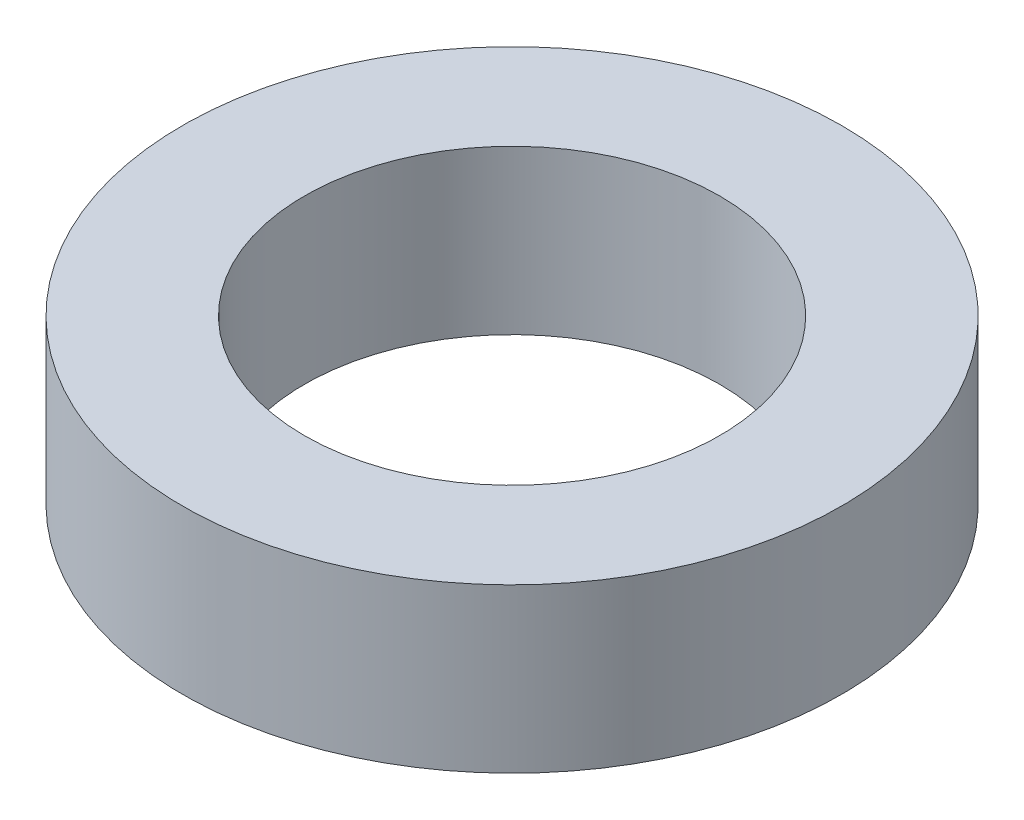
ISO-10303-21;
HEADER;
FILE_DESCRIPTION(('STEP AP214'),'2;1');
FILE_NAME('part.step','',(''),(''),'','','');
FILE_SCHEMA(('AUTOMOTIVE_DESIGN { 1 0 10303 214 1 1 1 1 }'));
ENDSEC;
DATA;
#1=APPLICATION_CONTEXT('core data for automotive mechanical design processes');
#2=APPLICATION_PROTOCOL_DEFINITION('international standard','automotive_design',2000,#1);
#3=PRODUCT_CONTEXT('',#1,'mechanical');
#4=PRODUCT('Part','Part','',(#3));
#5=PRODUCT_RELATED_PRODUCT_CATEGORY('part','',(#4));
#6=PRODUCT_DEFINITION_FORMATION('','',#4);
#7=PRODUCT_DEFINITION_CONTEXT('part definition',#1,'design');
#8=PRODUCT_DEFINITION('design','',#6,#7);
#9=PRODUCT_DEFINITION_SHAPE('','',#8);
#10=(LENGTH_UNIT() NAMED_UNIT(*) SI_UNIT(.MILLI.,.METRE.));
#11=(NAMED_UNIT(*) PLANE_ANGLE_UNIT() SI_UNIT($,.RADIAN.));
#12=(NAMED_UNIT(*) SI_UNIT($,.STERADIAN.) SOLID_ANGLE_UNIT());
#13=UNCERTAINTY_MEASURE_WITH_UNIT(LENGTH_MEASURE(1.E-05),#10,'distance_accuracy_value','');
#14=(GEOMETRIC_REPRESENTATION_CONTEXT(3) GLOBAL_UNCERTAINTY_ASSIGNED_CONTEXT((#13)) GLOBAL_UNIT_ASSIGNED_CONTEXT((#10,
#11,#12)) REPRESENTATION_CONTEXT('',''));
#15=CARTESIAN_POINT('',(0.,0.,0.));
#16=DIRECTION('',(0.,0.,1.));
#17=DIRECTION('',(1.,0.,0.));
#18=AXIS2_PLACEMENT_3D('',#15,#16,#17);
#19=CARTESIAN_POINT('',(0.,2.475,0.));
#20=DIRECTION('',(0.,1.,0.));
#21=DIRECTION('',(0.,0.,1.));
#22=AXIS2_PLACEMENT_3D('',#19,#20,#21);
#23=PLANE('',#22);
#24=CARTESIAN_POINT('',(0.,2.475,0.));
#25=DIRECTION('',(0.,1.,0.));
#26=DIRECTION('',(0.,0.,1.));
#27=AXIS2_PLACEMENT_3D('',#24,#25,#26);
#28=CIRCLE('',#27,5.);
#29=CARTESIAN_POINT('',(0.,2.475,-5.));
#30=VERTEX_POINT('',#29);
#31=EDGE_CURVE('E10',#30,#30,#28,.T.);
#32=ORIENTED_EDGE('',*,*,#31,.T.);
#33=EDGE_LOOP('',(#32));
#34=FACE_BOUND('',#33,.T.);
#35=CARTESIAN_POINT('',(0.,2.475,0.));
#36=DIRECTION('',(0.,1.,0.));
#37=DIRECTION('',(0.,0.,1.));
#38=AXIS2_PLACEMENT_3D('',#35,#36,#37);
#39=CIRCLE('',#38,3.15);
#40=CARTESIAN_POINT('',(0.,2.475,-3.15));
#41=VERTEX_POINT('',#40);
#42=EDGE_CURVE('E42',#41,#41,#39,.T.);
#43=ORIENTED_EDGE('',*,*,#42,.F.);
#44=EDGE_LOOP('',(#43));
#45=FACE_BOUND('',#44,.T.);
#46=ADVANCED_FACE('F31',(#34,#45),#23,.T.);
#47=CARTESIAN_POINT('',(0.,0.,0.));
#48=DIRECTION('',(0.,1.,0.));
#49=DIRECTION('',(0.,0.,1.));
#50=AXIS2_PLACEMENT_3D('',#47,#48,#49);
#51=PLANE('',#50);
#52=CARTESIAN_POINT('',(0.,0.,0.));
#53=DIRECTION('',(0.,1.,0.));
#54=DIRECTION('',(0.,0.,1.));
#55=AXIS2_PLACEMENT_3D('',#52,#53,#54);
#56=CIRCLE('',#55,5.);
#57=CARTESIAN_POINT('',(0.,0.,-5.));
#58=VERTEX_POINT('',#57);
#59=EDGE_CURVE('E35',#58,#58,#56,.T.);
#60=ORIENTED_EDGE('',*,*,#59,.F.);
#61=EDGE_LOOP('',(#60));
#62=FACE_BOUND('',#61,.T.);
#63=CARTESIAN_POINT('',(0.,0.,0.));
#64=DIRECTION('',(0.,1.,0.));
#65=DIRECTION('',(0.,0.,1.));
#66=AXIS2_PLACEMENT_3D('',#63,#64,#65);
#67=CIRCLE('',#66,3.15);
#68=CARTESIAN_POINT('',(0.,0.,-3.15));
#69=VERTEX_POINT('',#68);
#70=EDGE_CURVE('E44',#69,#69,#67,.T.);
#71=ORIENTED_EDGE('',*,*,#70,.T.);
#72=EDGE_LOOP('',(#71));
#73=FACE_BOUND('',#72,.T.);
#74=ADVANCED_FACE('F54',(#62,#73),#51,.F.);
#75=CARTESIAN_POINT('',(0.,2.475,0.));
#76=DIRECTION('',(0.,-1.,0.));
#77=DIRECTION('',(0.,0.,-1.));
#78=AXIS2_PLACEMENT_3D('',#75,#76,#77);
#79=CYLINDRICAL_SURFACE('',#78,5.);
#80=CARTESIAN_POINT('',(0.,2.475,-5.));
#81=CARTESIAN_POINT('',(0.,2.44921875,-5.));
#82=CARTESIAN_POINT('',(0.,2.4234375,-5.));
#83=CARTESIAN_POINT('',(0.,2.371875,-5.));
#84=CARTESIAN_POINT('',(0.,2.34609375,-5.));
#85=CARTESIAN_POINT('',(0.,2.29453125,-5.));
#86=CARTESIAN_POINT('',(0.,2.26875,-5.));
#87=CARTESIAN_POINT('',(0.,2.2171875,-5.));
#88=CARTESIAN_POINT('',(0.,2.19140625,-5.));
#89=CARTESIAN_POINT('',(0.,2.13984375,-5.));
#90=CARTESIAN_POINT('',(0.,2.1140625,-5.));
#91=CARTESIAN_POINT('',(0.,2.0625,-5.));
#92=CARTESIAN_POINT('',(0.,2.03671875,-5.));
#93=CARTESIAN_POINT('',(0.,1.98515625,-5.));
#94=CARTESIAN_POINT('',(0.,1.959375,-5.));
#95=CARTESIAN_POINT('',(0.,1.9078125,-5.));
#96=CARTESIAN_POINT('',(0.,1.88203125,-5.));
#97=CARTESIAN_POINT('',(0.,1.83046875,-5.));
#98=CARTESIAN_POINT('',(0.,1.8046875,-5.));
#99=CARTESIAN_POINT('',(0.,1.753125,-5.));
#100=CARTESIAN_POINT('',(0.,1.72734375,-5.));
#101=CARTESIAN_POINT('',(0.,1.67578125,-5.));
#102=CARTESIAN_POINT('',(0.,1.65,-5.));
#103=CARTESIAN_POINT('',(0.,1.5984375,-5.));
#104=CARTESIAN_POINT('',(0.,1.57265625,-5.));
#105=CARTESIAN_POINT('',(0.,1.52109375,-5.));
#106=CARTESIAN_POINT('',(0.,1.4953125,-5.));
#107=CARTESIAN_POINT('',(0.,1.44375,-5.));
#108=CARTESIAN_POINT('',(0.,1.41796875,-5.));
#109=CARTESIAN_POINT('',(0.,1.36640625,-5.));
#110=CARTESIAN_POINT('',(0.,1.340625,-5.));
#111=CARTESIAN_POINT('',(0.,1.2890625,-5.));
#112=CARTESIAN_POINT('',(0.,1.26328125,-5.));
#113=CARTESIAN_POINT('',(0.,1.21171875,-5.));
#114=CARTESIAN_POINT('',(0.,1.1859375,-5.));
#115=CARTESIAN_POINT('',(0.,1.134375,-5.));
#116=CARTESIAN_POINT('',(0.,1.10859375,-5.));
#117=CARTESIAN_POINT('',(0.,1.05703125,-5.));
#118=CARTESIAN_POINT('',(0.,1.03125,-5.));
#119=CARTESIAN_POINT('',(0.,0.9796875,-5.));
#120=CARTESIAN_POINT('',(0.,0.95390625,-5.));
#121=CARTESIAN_POINT('',(0.,0.90234375,-5.));
#122=CARTESIAN_POINT('',(0.,0.8765625,-5.));
#123=CARTESIAN_POINT('',(0.,0.825,-5.));
#124=CARTESIAN_POINT('',(0.,0.79921875,-5.));
#125=CARTESIAN_POINT('',(0.,0.74765625,-5.));
#126=CARTESIAN_POINT('',(0.,0.721875,-5.));
#127=CARTESIAN_POINT('',(0.,0.6703125,-5.));
#128=CARTESIAN_POINT('',(0.,0.64453125,-5.));
#129=CARTESIAN_POINT('',(0.,0.59296875,-5.));
#130=CARTESIAN_POINT('',(0.,0.5671875,-5.));
#131=CARTESIAN_POINT('',(0.,0.515625,-5.));
#132=CARTESIAN_POINT('',(0.,0.48984375,-5.));
#133=CARTESIAN_POINT('',(0.,0.43828125,-5.));
#134=CARTESIAN_POINT('',(0.,0.4125,-5.));
#135=CARTESIAN_POINT('',(0.,0.3609375,-5.));
#136=CARTESIAN_POINT('',(0.,0.33515625,-5.));
#137=CARTESIAN_POINT('',(0.,0.28359375,-5.));
#138=CARTESIAN_POINT('',(0.,0.2578125,-5.));
#139=CARTESIAN_POINT('',(0.,0.20625,-5.));
#140=CARTESIAN_POINT('',(0.,0.18046875,-5.));
#141=CARTESIAN_POINT('',(0.,0.12890625,-5.));
#142=CARTESIAN_POINT('',(0.,0.103125,-5.));
#143=CARTESIAN_POINT('',(0.,0.0515625000000001,-5.));
#144=CARTESIAN_POINT('',(0.,0.0257812500000001,-5.));
#145=CARTESIAN_POINT('',(0.,0.,-5.));
#146=B_SPLINE_CURVE_WITH_KNOTS('',3,(#80,#81,#82,#83,#84,#85,#86,#87,#88,#89,#90,#91,#92,#93,
#94,#95,#96,#97,#98,#99,#100,#101,#102,#103,#104,#105,#106,#107,#108,#109,#110,#111,#112,#113,
#114,#115,#116,#117,#118,#119,#120,#121,#122,#123,#124,#125,#126,#127,#128,#129,#130,#131,#132,
#133,#134,#135,#136,#137,#138,#139,#140,#141,#142,#143,#144,#145),.UNSPECIFIED.,.F.,.F.,(4,2,2,
2,2,2,2,2,2,2,2,2,2,2,2,2,2,2,2,2,2,2,2,2,2,2,2,2,2,2,2,2,4),(0.,0.0773437500000002,0.1546875,
0.23203125,0.309375,0.38671875,0.4640625,0.54140625,0.61875,0.69609375,0.7734375,0.85078125,
0.928125,1.00546875,1.0828125,1.16015625,1.2375,1.31484375,1.3921875,1.46953125,1.546875,
1.62421875,1.7015625,1.77890625,1.85625,1.93359375,2.0109375,2.08828125,2.165625,2.24296875,
2.3203125,2.39765625,2.475),.UNSPECIFIED.);
#147=EDGE_CURVE('BSEAM33',#30,#58,#146,.T.);
#148=ORIENTED_EDGE('',*,*,#31,.F.);
#149=ORIENTED_EDGE('',*,*,#59,.T.);
#150=ORIENTED_EDGE('',*,*,#147,.T.);
#151=ORIENTED_EDGE('',*,*,#147,.F.);
#152=EDGE_LOOP('',(#148,#150,#149,#151));
#153=FACE_BOUND('',#152,.T.);
#154=ADVANCED_FACE('F33',(#153),#79,.T.);
#155=CARTESIAN_POINT('',(0.,2.475,0.));
#156=DIRECTION('',(0.,-1.,0.));
#157=DIRECTION('',(0.,0.,-1.));
#158=AXIS2_PLACEMENT_3D('',#155,#156,#157);
#159=CYLINDRICAL_SURFACE('',#158,3.15);
#160=CARTESIAN_POINT('',(0.,2.475,-3.15));
#161=CARTESIAN_POINT('',(0.,2.44921875,-3.15));
#162=CARTESIAN_POINT('',(0.,2.4234375,-3.15));
#163=CARTESIAN_POINT('',(0.,2.371875,-3.15));
#164=CARTESIAN_POINT('',(0.,2.34609375,-3.15));
#165=CARTESIAN_POINT('',(0.,2.29453125,-3.15));
#166=CARTESIAN_POINT('',(0.,2.26875,-3.15));
#167=CARTESIAN_POINT('',(0.,2.2171875,-3.15));
#168=CARTESIAN_POINT('',(0.,2.19140625,-3.15));
#169=CARTESIAN_POINT('',(0.,2.13984375,-3.15));
#170=CARTESIAN_POINT('',(0.,2.1140625,-3.15));
#171=CARTESIAN_POINT('',(0.,2.0625,-3.15));
#172=CARTESIAN_POINT('',(0.,2.03671875,-3.15));
#173=CARTESIAN_POINT('',(0.,1.98515625,-3.15));
#174=CARTESIAN_POINT('',(0.,1.959375,-3.15));
#175=CARTESIAN_POINT('',(0.,1.9078125,-3.15));
#176=CARTESIAN_POINT('',(0.,1.88203125,-3.15));
#177=CARTESIAN_POINT('',(0.,1.83046875,-3.15));
#178=CARTESIAN_POINT('',(0.,1.8046875,-3.15));
#179=CARTESIAN_POINT('',(0.,1.753125,-3.15));
#180=CARTESIAN_POINT('',(0.,1.72734375,-3.15));
#181=CARTESIAN_POINT('',(0.,1.67578125,-3.15));
#182=CARTESIAN_POINT('',(0.,1.65,-3.15));
#183=CARTESIAN_POINT('',(0.,1.5984375,-3.15));
#184=CARTESIAN_POINT('',(0.,1.57265625,-3.15));
#185=CARTESIAN_POINT('',(0.,1.52109375,-3.15));
#186=CARTESIAN_POINT('',(0.,1.4953125,-3.15));
#187=CARTESIAN_POINT('',(0.,1.44375,-3.15));
#188=CARTESIAN_POINT('',(0.,1.41796875,-3.15));
#189=CARTESIAN_POINT('',(0.,1.36640625,-3.15));
#190=CARTESIAN_POINT('',(0.,1.340625,-3.15));
#191=CARTESIAN_POINT('',(0.,1.2890625,-3.15));
#192=CARTESIAN_POINT('',(0.,1.26328125,-3.15));
#193=CARTESIAN_POINT('',(0.,1.21171875,-3.15));
#194=CARTESIAN_POINT('',(0.,1.1859375,-3.15));
#195=CARTESIAN_POINT('',(0.,1.134375,-3.15));
#196=CARTESIAN_POINT('',(0.,1.10859375,-3.15));
#197=CARTESIAN_POINT('',(0.,1.05703125,-3.15));
#198=CARTESIAN_POINT('',(0.,1.03125,-3.15));
#199=CARTESIAN_POINT('',(0.,0.9796875,-3.15));
#200=CARTESIAN_POINT('',(0.,0.95390625,-3.15));
#201=CARTESIAN_POINT('',(0.,0.90234375,-3.15));
#202=CARTESIAN_POINT('',(0.,0.8765625,-3.15));
#203=CARTESIAN_POINT('',(0.,0.825,-3.15));
#204=CARTESIAN_POINT('',(0.,0.79921875,-3.15));
#205=CARTESIAN_POINT('',(0.,0.74765625,-3.15));
#206=CARTESIAN_POINT('',(0.,0.721875,-3.15));
#207=CARTESIAN_POINT('',(0.,0.6703125,-3.15));
#208=CARTESIAN_POINT('',(0.,0.64453125,-3.15));
#209=CARTESIAN_POINT('',(0.,0.59296875,-3.15));
#210=CARTESIAN_POINT('',(0.,0.5671875,-3.15));
#211=CARTESIAN_POINT('',(0.,0.515625,-3.15));
#212=CARTESIAN_POINT('',(0.,0.48984375,-3.15));
#213=CARTESIAN_POINT('',(0.,0.43828125,-3.15));
#214=CARTESIAN_POINT('',(0.,0.4125,-3.15));
#215=CARTESIAN_POINT('',(0.,0.3609375,-3.15));
#216=CARTESIAN_POINT('',(0.,0.33515625,-3.15));
#217=CARTESIAN_POINT('',(0.,0.28359375,-3.15));
#218=CARTESIAN_POINT('',(0.,0.2578125,-3.15));
#219=CARTESIAN_POINT('',(0.,0.20625,-3.15));
#220=CARTESIAN_POINT('',(0.,0.18046875,-3.15));
#221=CARTESIAN_POINT('',(0.,0.12890625,-3.15));
#222=CARTESIAN_POINT('',(0.,0.103125,-3.15));
#223=CARTESIAN_POINT('',(0.,0.0515625000000001,-3.15));
#224=CARTESIAN_POINT('',(0.,0.0257812500000001,-3.15));
#225=CARTESIAN_POINT('',(0.,0.,-3.15));
#226=B_SPLINE_CURVE_WITH_KNOTS('',3,(#160,#161,#162,#163,#164,#165,#166,#167,#168,#169,#170,
#171,#172,#173,#174,#175,#176,#177,#178,#179,#180,#181,#182,#183,#184,#185,#186,#187,#188,#189,
#190,#191,#192,#193,#194,#195,#196,#197,#198,#199,#200,#201,#202,#203,#204,#205,#206,#207,#208,
#209,#210,#211,#212,#213,#214,#215,#216,#217,#218,#219,#220,#221,#222,#223,#224,#225),
.UNSPECIFIED.,.F.,.F.,(4,2,2,2,2,2,2,2,2,2,2,2,2,2,2,2,2,2,2,2,2,2,2,2,2,2,2,2,2,2,2,2,4),(0.,
0.0773437500000002,0.1546875,0.23203125,0.309375,0.38671875,0.4640625,0.54140625,0.61875,
0.69609375,0.7734375,0.85078125,0.928125,1.00546875,1.0828125,1.16015625,1.2375,1.31484375,
1.3921875,1.46953125,1.546875,1.62421875,1.7015625,1.77890625,1.85625,1.93359375,2.0109375,
2.08828125,2.165625,2.24296875,2.3203125,2.39765625,2.475),.UNSPECIFIED.);
#227=EDGE_CURVE('BSEAM50',#41,#69,#226,.T.);
#228=ORIENTED_EDGE('',*,*,#42,.T.);
#229=ORIENTED_EDGE('',*,*,#70,.F.);
#230=ORIENTED_EDGE('',*,*,#227,.T.);
#231=ORIENTED_EDGE('',*,*,#227,.F.);
#232=EDGE_LOOP('',(#228,#230,#229,#231));
#233=FACE_BOUND('',#232,.T.);
#234=ADVANCED_FACE('F50',(#233),#159,.F.);
#235=CLOSED_SHELL('',(#46,#74,#154,#234));
#236=MANIFOLD_SOLID_BREP('B2',#235);
#237=ADVANCED_BREP_SHAPE_REPRESENTATION('',(#18,#236),#14);
#238=SHAPE_DEFINITION_REPRESENTATION(#9,#237);
ENDSEC;
END-ISO-10303-21;
